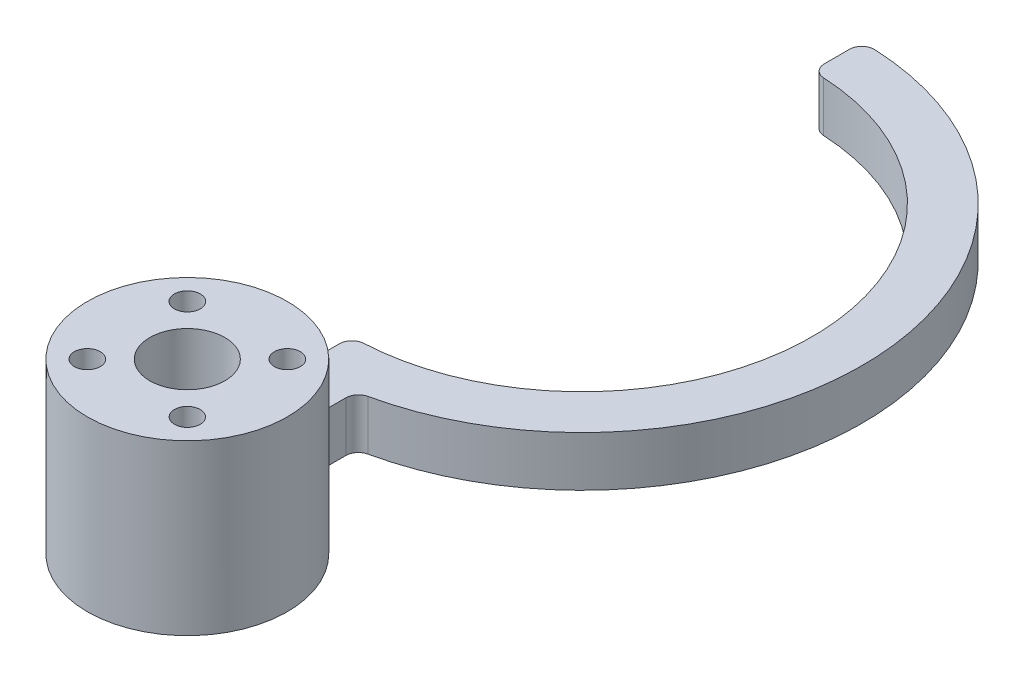
ISO-10303-21;
HEADER;
FILE_DESCRIPTION(('STEP AP214'),'2;1');
FILE_NAME('part.step','',(''),(''),'','','');
FILE_SCHEMA(('AUTOMOTIVE_DESIGN { 1 0 10303 214 1 1 1 1 }'));
ENDSEC;
DATA;
#1=APPLICATION_CONTEXT('core data for automotive mechanical design processes');
#2=APPLICATION_PROTOCOL_DEFINITION('international standard','automotive_design',2000,#1);
#3=PRODUCT_CONTEXT('',#1,'mechanical');
#4=PRODUCT('Part','Part','',(#3));
#5=PRODUCT_RELATED_PRODUCT_CATEGORY('part','',(#4));
#6=PRODUCT_DEFINITION_FORMATION('','',#4);
#7=PRODUCT_DEFINITION_CONTEXT('part definition',#1,'design');
#8=PRODUCT_DEFINITION('design','',#6,#7);
#9=PRODUCT_DEFINITION_SHAPE('','',#8);
#10=(LENGTH_UNIT() NAMED_UNIT(*) SI_UNIT(.MILLI.,.METRE.));
#11=(NAMED_UNIT(*) PLANE_ANGLE_UNIT() SI_UNIT($,.RADIAN.));
#12=(NAMED_UNIT(*) SI_UNIT($,.STERADIAN.) SOLID_ANGLE_UNIT());
#13=UNCERTAINTY_MEASURE_WITH_UNIT(LENGTH_MEASURE(1.E-05),#10,'distance_accuracy_value','');
#14=(GEOMETRIC_REPRESENTATION_CONTEXT(3) GLOBAL_UNCERTAINTY_ASSIGNED_CONTEXT((#13)) GLOBAL_UNIT_ASSIGNED_CONTEXT((#10,
#11,#12)) REPRESENTATION_CONTEXT('',''));
#15=CARTESIAN_POINT('',(0.,0.,0.));
#16=DIRECTION('',(0.,0.,1.));
#17=DIRECTION('',(1.,0.,0.));
#18=AXIS2_PLACEMENT_3D('',#15,#16,#17);
#19=CARTESIAN_POINT('',(8.96696536966746,8.,72.0811709693591));
#20=DIRECTION('',(0.,-1.,0.));
#21=DIRECTION('',(0.,0.,-1.));
#22=AXIS2_PLACEMENT_3D('',#19,#20,#21);
#23=CYLINDRICAL_SURFACE('',#22,16.);
#24=CARTESIAN_POINT('',(8.96696536966746,0.,72.0811709693591));
#25=DIRECTION('',(0.,1.,0.));
#26=DIRECTION('',(0.,0.,1.));
#27=AXIS2_PLACEMENT_3D('',#24,#25,#26);
#28=CIRCLE('',#27,16.);
#29=CARTESIAN_POINT('',(-0.781448292259167,0.,59.3938374797734));
#30=VERTEX_POINT('',#29);
#31=CARTESIAN_POINT('',(9.8852183744075,0.,56.1075423453023));
#32=VERTEX_POINT('',#31);
#33=EDGE_CURVE('E144',#30,#32,#28,.T.);
#34=ORIENTED_EDGE('',*,*,#33,.T.);
#35=DIRECTION('',(0.,-1.,0.));
#36=VECTOR('',#35,1.);
#37=CARTESIAN_POINT('',(9.8852183744075,8.,56.1075423453023));
#38=LINE('',#37,#36);
#39=CARTESIAN_POINT('',(9.8852183744075,8.,56.1075423453023));
#40=VERTEX_POINT('',#39);
#41=EDGE_CURVE('E128',#32,#40,#38,.F.);
#42=ORIENTED_EDGE('',*,*,#41,.T.);
#43=CARTESIAN_POINT('',(8.96696536966746,8.,72.0811709693591));
#44=DIRECTION('',(0.,1.,0.));
#45=DIRECTION('',(0.,0.,1.));
#46=AXIS2_PLACEMENT_3D('',#43,#44,#45);
#47=CIRCLE('',#46,16.);
#48=CARTESIAN_POINT('',(-0.781448292259167,8.,59.3938374797734));
#49=VERTEX_POINT('',#48);
#50=EDGE_CURVE('E142',#40,#49,#47,.T.);
#51=ORIENTED_EDGE('',*,*,#50,.T.);
#52=DIRECTION('',(0.,-1.,0.));
#53=VECTOR('',#52,1.);
#54=CARTESIAN_POINT('',(-0.781448292259167,8.,59.3938374797734));
#55=LINE('',#54,#53);
#56=EDGE_CURVE('E146',#49,#30,#55,.T.);
#57=ORIENTED_EDGE('',*,*,#56,.T.);
#58=EDGE_LOOP('',(#34,#42,#51,#57));
#59=FACE_BOUND('',#58,.T.);
#60=CARTESIAN_POINT('',(8.96696536966746,27.,72.0811709693591));
#61=DIRECTION('',(0.,1.,0.));
#62=DIRECTION('',(0.,0.,1.));
#63=AXIS2_PLACEMENT_3D('',#60,#61,#62);
#64=CIRCLE('',#63,16.);
#65=CARTESIAN_POINT('',(8.96696536966746,27.,88.0811709693591));
#66=VERTEX_POINT('',#65);
#67=EDGE_CURVE('E152',#66,#66,#64,.T.);
#68=ORIENTED_EDGE('',*,*,#67,.F.);
#69=EDGE_LOOP('',(#68));
#70=FACE_BOUND('',#69,.T.);
#71=ADVANCED_FACE('F35',(#59,#70),#23,.T.);
#72=CARTESIAN_POINT('',(8.00000000000002,8.,0.));
#73=DIRECTION('',(1.,0.,0.));
#74=DIRECTION('',(0.,0.,-1.));
#75=AXIS2_PLACEMENT_3D('',#72,#73,#74);
#76=PLANE('',#75);
#77=DIRECTION('',(0.,0.,1.));
#78=VECTOR('',#77,1.);
#79=CARTESIAN_POINT('',(8.00000000000002,8.,0.));
#80=LINE('',#79,#78);
#81=CARTESIAN_POINT('',(8.,8.,45.7498513658788));
#82=VERTEX_POINT('',#81);
#83=CARTESIAN_POINT('',(8.,8.,54.1108387672952));
#84=VERTEX_POINT('',#83);
#85=EDGE_CURVE('E165',#82,#84,#80,.T.);
#86=ORIENTED_EDGE('',*,*,#85,.T.);
#87=DIRECTION('',(0.,-1.,0.));
#88=VECTOR('',#87,1.);
#89=CARTESIAN_POINT('',(8.,8.,54.1108387672952));
#90=LINE('',#89,#88);
#91=CARTESIAN_POINT('',(8.,0.,54.1108387672952));
#92=VERTEX_POINT('',#91);
#93=EDGE_CURVE('E130',#84,#92,#90,.T.);
#94=ORIENTED_EDGE('',*,*,#93,.T.);
#95=DIRECTION('',(0.,0.,1.));
#96=VECTOR('',#95,1.);
#97=CARTESIAN_POINT('',(8.00000000000002,0.,0.));
#98=LINE('',#97,#96);
#99=CARTESIAN_POINT('',(8.,0.,45.7498513658788));
#100=VERTEX_POINT('',#99);
#101=EDGE_CURVE('E193',#100,#92,#98,.T.);
#102=ORIENTED_EDGE('',*,*,#101,.F.);
#103=DIRECTION('',(0.,-1.,0.));
#104=VECTOR('',#103,1.);
#105=CARTESIAN_POINT('',(8.,8.,45.7498513658788));
#106=LINE('',#105,#104);
#107=EDGE_CURVE('E177',#100,#82,#106,.F.);
#108=ORIENTED_EDGE('',*,*,#107,.T.);
#109=EDGE_LOOP('',(#86,#94,#102,#108));
#110=FACE_BOUND('',#109,.T.);
#111=ADVANCED_FACE('F267',(#110),#76,.T.);
#112=CARTESIAN_POINT('',(0.,8.,0.));
#113=DIRECTION('',(0.,-1.,0.));
#114=DIRECTION('',(0.,0.,-1.));
#115=AXIS2_PLACEMENT_3D('',#112,#113,#114);
#116=CYLINDRICAL_SURFACE('',#115,44.83);
#117=CARTESIAN_POINT('',(0.,8.,0.));
#118=DIRECTION('',(0.,1.,0.));
#119=DIRECTION('',(0.,0.,1.));
#120=AXIS2_PLACEMENT_3D('',#117,#118,#119);
#121=CIRCLE('',#120,44.83);
#122=CARTESIAN_POINT('',(9.57292333973949,8.,43.7959819930033));
#123=VERTEX_POINT('',#122);
#124=CARTESIAN_POINT('',(2.09339248190515,8.,-44.7810965466089));
#125=VERTEX_POINT('',#124);
#126=EDGE_CURVE('E167',#123,#125,#121,.T.);
#127=ORIENTED_EDGE('',*,*,#126,.F.);
#128=DIRECTION('',(0.,-1.,0.));
#129=VECTOR('',#128,1.);
#130=CARTESIAN_POINT('',(9.57292333973949,8.,43.7959819930033));
#131=LINE('',#130,#129);
#132=CARTESIAN_POINT('',(9.57292333973949,0.,43.7959819930033));
#133=VERTEX_POINT('',#132);
#134=EDGE_CURVE('E210',#123,#133,#131,.T.);
#135=ORIENTED_EDGE('',*,*,#134,.T.);
#136=CARTESIAN_POINT('',(0.,0.,0.));
#137=DIRECTION('',(0.,1.,0.));
#138=DIRECTION('',(0.,0.,1.));
#139=AXIS2_PLACEMENT_3D('',#136,#137,#138);
#140=CIRCLE('',#139,44.83);
#141=CARTESIAN_POINT('',(2.09339248190515,0.,-44.7810965466089));
#142=VERTEX_POINT('',#141);
#143=EDGE_CURVE('E196',#133,#142,#140,.T.);
#144=ORIENTED_EDGE('',*,*,#143,.T.);
#145=DIRECTION('',(0.,-1.,0.));
#146=VECTOR('',#145,1.);
#147=CARTESIAN_POINT('',(2.09339248190515,8.,-44.7810965466089));
#148=LINE('',#147,#146);
#149=EDGE_CURVE('E145',#142,#125,#148,.F.);
#150=ORIENTED_EDGE('',*,*,#149,.T.);
#151=EDGE_LOOP('',(#127,#135,#144,#150));
#152=FACE_BOUND('',#151,.T.);
#153=ADVANCED_FACE('F274',(#152),#116,.T.);
#154=CARTESIAN_POINT('',(0.,8.,0.));
#155=DIRECTION('',(1.,0.,0.));
#156=DIRECTION('',(0.,0.,-1.));
#157=AXIS2_PLACEMENT_3D('',#154,#155,#156);
#158=PLANE('',#157);
#159=DIRECTION('',(0.,0.,1.));
#160=VECTOR('',#159,1.);
#161=CARTESIAN_POINT('',(0.,0.,0.));
#162=LINE('',#161,#160);
#163=CARTESIAN_POINT('',(0.,0.,-42.7832782755132));
#164=VERTEX_POINT('',#163);
#165=CARTESIAN_POINT('',(0.,0.,-38.7784592267408));
#166=VERTEX_POINT('',#165);
#167=EDGE_CURVE('E199',#164,#166,#162,.T.);
#168=ORIENTED_EDGE('',*,*,#167,.T.);
#169=DIRECTION('',(0.,1.,0.));
#170=VECTOR('',#169,1.);
#171=CARTESIAN_POINT('',(0.,8.,-38.7784592267408));
#172=LINE('',#171,#170);
#173=CARTESIAN_POINT('',(0.,8.,-38.7784592267408));
#174=VERTEX_POINT('',#173);
#175=EDGE_CURVE('E50',#166,#174,#172,.T.);
#176=ORIENTED_EDGE('',*,*,#175,.T.);
#177=DIRECTION('',(0.,0.,1.));
#178=VECTOR('',#177,1.);
#179=CARTESIAN_POINT('',(0.,8.,0.));
#180=LINE('',#179,#178);
#181=CARTESIAN_POINT('',(0.,8.,-42.7832782755132));
#182=VERTEX_POINT('',#181);
#183=EDGE_CURVE('E170',#182,#174,#180,.T.);
#184=ORIENTED_EDGE('',*,*,#183,.F.);
#185=DIRECTION('',(0.,-1.,0.));
#186=VECTOR('',#185,1.);
#187=CARTESIAN_POINT('',(0.,8.,-42.7832782755132));
#188=LINE('',#187,#186);
#189=EDGE_CURVE('E234',#182,#164,#188,.T.);
#190=ORIENTED_EDGE('',*,*,#189,.T.);
#191=EDGE_LOOP('',(#168,#176,#184,#190));
#192=FACE_BOUND('',#191,.T.);
#193=ADVANCED_FACE('F316',(#192),#158,.F.);
#194=CARTESIAN_POINT('',(0.,8.,0.));
#195=DIRECTION('',(0.,-1.,0.));
#196=DIRECTION('',(0.,0.,-1.));
#197=AXIS2_PLACEMENT_3D('',#194,#195,#196);
#198=CYLINDRICAL_SURFACE('',#197,36.83);
#199=CARTESIAN_POINT('',(0.,0.,0.));
#200=DIRECTION('',(0.,1.,0.));
#201=DIRECTION('',(0.,0.,1.));
#202=AXIS2_PLACEMENT_3D('',#199,#200,#201);
#203=CIRCLE('',#202,36.83);
#204=CARTESIAN_POINT('',(1.8969868658254,0.,36.7811139150364));
#205=VERTEX_POINT('',#204);
#206=CARTESIAN_POINT('',(1.89698686582535,0.,-36.7811139150364));
#207=VERTEX_POINT('',#206);
#208=EDGE_CURVE('E201',#205,#207,#203,.T.);
#209=ORIENTED_EDGE('',*,*,#208,.F.);
#210=DIRECTION('',(0.,-1.,0.));
#211=VECTOR('',#210,1.);
#212=CARTESIAN_POINT('',(1.8969868658254,8.,36.7811139150364));
#213=LINE('',#212,#211);
#214=CARTESIAN_POINT('',(1.8969868658254,8.,36.7811139150364));
#215=VERTEX_POINT('',#214);
#216=EDGE_CURVE('E227',#205,#215,#213,.F.);
#217=ORIENTED_EDGE('',*,*,#216,.T.);
#218=CARTESIAN_POINT('',(0.,8.,0.));
#219=DIRECTION('',(0.,1.,0.));
#220=DIRECTION('',(0.,0.,1.));
#221=AXIS2_PLACEMENT_3D('',#218,#219,#220);
#222=CIRCLE('',#221,36.83);
#223=CARTESIAN_POINT('',(1.89698686582535,8.,-36.7811139150364));
#224=VERTEX_POINT('',#223);
#225=EDGE_CURVE('E172',#215,#224,#222,.T.);
#226=ORIENTED_EDGE('',*,*,#225,.T.);
#227=DIRECTION('',(0.,-1.,0.));
#228=VECTOR('',#227,1.);
#229=CARTESIAN_POINT('',(1.89698686582535,8.,-36.7811139150364));
#230=LINE('',#229,#228);
#231=EDGE_CURVE('E224',#224,#207,#230,.T.);
#232=ORIENTED_EDGE('',*,*,#231,.T.);
#233=EDGE_LOOP('',(#209,#217,#226,#232));
#234=FACE_BOUND('',#233,.T.);
#235=ADVANCED_FACE('F282',(#234),#198,.F.);
#236=CARTESIAN_POINT('',(0.966965369667458,8.,80.0811709693591));
#237=DIRECTION('',(0.,-1.,0.));
#238=DIRECTION('',(0.,0.,-1.));
#239=AXIS2_PLACEMENT_3D('',#236,#237,#238);
#240=CYLINDRICAL_SURFACE('',#239,2.07500000000001);
#241=CARTESIAN_POINT('',(0.966965369667458,0.,80.0811709693591));
#242=DIRECTION('',(0.,1.,0.));
#243=DIRECTION('',(0.,0.,1.));
#244=AXIS2_PLACEMENT_3D('',#241,#242,#243);
#245=CIRCLE('',#244,2.07500000000001);
#246=CARTESIAN_POINT('',(0.966965369667458,0.,82.1561709693591));
#247=VERTEX_POINT('',#246);
#248=EDGE_CURVE('E189',#247,#247,#245,.T.);
#249=ORIENTED_EDGE('',*,*,#248,.F.);
#250=EDGE_LOOP('',(#249));
#251=FACE_BOUND('',#250,.T.);
#252=CARTESIAN_POINT('',(0.966965369667458,27.,80.0811709693591));
#253=DIRECTION('',(0.,1.,0.));
#254=DIRECTION('',(0.,0.,1.));
#255=AXIS2_PLACEMENT_3D('',#252,#253,#254);
#256=CIRCLE('',#255,2.07500000000001);
#257=CARTESIAN_POINT('',(0.966965369667458,27.,82.1561709693591));
#258=VERTEX_POINT('',#257);
#259=EDGE_CURVE('E368',#258,#258,#256,.T.);
#260=ORIENTED_EDGE('',*,*,#259,.T.);
#261=EDGE_LOOP('',(#260));
#262=FACE_BOUND('',#261,.T.);
#263=ADVANCED_FACE('F279',(#251,#262),#240,.F.);
#264=CARTESIAN_POINT('',(16.9669653696675,8.,80.0811709693591));
#265=DIRECTION('',(0.,-1.,0.));
#266=DIRECTION('',(0.,0.,-1.));
#267=AXIS2_PLACEMENT_3D('',#264,#265,#266);
#268=CYLINDRICAL_SURFACE('',#267,2.07500000000001);
#269=CARTESIAN_POINT('',(16.9669653696675,8.,80.0811709693591));
#270=DIRECTION('',(0.,1.,0.));
#271=DIRECTION('',(0.,0.,1.));
#272=AXIS2_PLACEMENT_3D('',#269,#270,#271);
#273=CIRCLE('',#272,2.07500000000001);
#274=CARTESIAN_POINT('',(16.9669653696675,8.,82.1561709693591));
#275=VERTEX_POINT('',#274);
#276=EDGE_CURVE('E156',#275,#275,#273,.T.);
#277=ORIENTED_EDGE('',*,*,#276,.T.);
#278=EDGE_LOOP('',(#277));
#279=FACE_BOUND('',#278,.T.);
#280=CARTESIAN_POINT('',(16.9669653696675,0.,80.0811709693591));
#281=DIRECTION('',(0.,1.,0.));
#282=DIRECTION('',(0.,0.,1.));
#283=AXIS2_PLACEMENT_3D('',#280,#281,#282);
#284=CIRCLE('',#283,2.07500000000001);
#285=CARTESIAN_POINT('',(16.9669653696675,0.,82.1561709693591));
#286=VERTEX_POINT('',#285);
#287=EDGE_CURVE('E186',#286,#286,#284,.T.);
#288=ORIENTED_EDGE('',*,*,#287,.F.);
#289=EDGE_LOOP('',(#288));
#290=FACE_BOUND('',#289,.T.);
#291=ADVANCED_FACE('F281',(#279,#290),#268,.F.);
#292=CARTESIAN_POINT('',(16.9669653696675,8.,64.0811709693591));
#293=DIRECTION('',(0.,-1.,0.));
#294=DIRECTION('',(0.,0.,-1.));
#295=AXIS2_PLACEMENT_3D('',#292,#293,#294);
#296=CYLINDRICAL_SURFACE('',#295,2.075);
#297=CARTESIAN_POINT('',(16.9669653696675,0.,64.0811709693591));
#298=DIRECTION('',(0.,1.,0.));
#299=DIRECTION('',(0.,0.,1.));
#300=AXIS2_PLACEMENT_3D('',#297,#298,#299);
#301=CIRCLE('',#300,2.075);
#302=CARTESIAN_POINT('',(16.9669653696675,0.,66.1561709693591));
#303=VERTEX_POINT('',#302);
#304=EDGE_CURVE('E183',#303,#303,#301,.T.);
#305=ORIENTED_EDGE('',*,*,#304,.F.);
#306=EDGE_LOOP('',(#305));
#307=FACE_BOUND('',#306,.T.);
#308=CARTESIAN_POINT('',(16.9669653696675,27.,64.0811709693591));
#309=DIRECTION('',(0.,1.,0.));
#310=DIRECTION('',(0.,0.,1.));
#311=AXIS2_PLACEMENT_3D('',#308,#309,#310);
#312=CIRCLE('',#311,2.07499999999999);
#313=CARTESIAN_POINT('',(16.9669653696675,27.,66.1561709693591));
#314=VERTEX_POINT('',#313);
#315=EDGE_CURVE('E370',#314,#314,#312,.T.);
#316=ORIENTED_EDGE('',*,*,#315,.T.);
#317=EDGE_LOOP('',(#316));
#318=FACE_BOUND('',#317,.T.);
#319=ADVANCED_FACE('F286',(#307,#318),#296,.F.);
#320=CARTESIAN_POINT('',(0.966965369667458,8.,64.0811709693591));
#321=DIRECTION('',(0.,-1.,0.));
#322=DIRECTION('',(0.,0.,-1.));
#323=AXIS2_PLACEMENT_3D('',#320,#321,#322);
#324=CYLINDRICAL_SURFACE('',#323,2.07500000000001);
#325=CARTESIAN_POINT('',(0.966965369667458,0.,64.0811709693591));
#326=DIRECTION('',(0.,1.,0.));
#327=DIRECTION('',(0.,0.,1.));
#328=AXIS2_PLACEMENT_3D('',#325,#326,#327);
#329=CIRCLE('',#328,2.07500000000001);
#330=CARTESIAN_POINT('',(0.966965369667458,0.,66.1561709693591));
#331=VERTEX_POINT('',#330);
#332=EDGE_CURVE('E180',#331,#331,#329,.T.);
#333=ORIENTED_EDGE('',*,*,#332,.F.);
#334=EDGE_LOOP('',(#333));
#335=FACE_BOUND('',#334,.T.);
#336=CARTESIAN_POINT('',(0.966965369667458,27.,64.0811709693591));
#337=DIRECTION('',(0.,1.,0.));
#338=DIRECTION('',(0.,0.,1.));
#339=AXIS2_PLACEMENT_3D('',#336,#337,#338);
#340=CIRCLE('',#339,2.075);
#341=CARTESIAN_POINT('',(0.966965369667458,27.,66.1561709693591));
#342=VERTEX_POINT('',#341);
#343=EDGE_CURVE('E153',#342,#342,#340,.T.);
#344=ORIENTED_EDGE('',*,*,#343,.T.);
#345=EDGE_LOOP('',(#344));
#346=FACE_BOUND('',#345,.T.);
#347=ADVANCED_FACE('F290',(#335,#346),#324,.F.);
#348=CARTESIAN_POINT('',(8.96696536966746,8.,72.0811709693591));
#349=DIRECTION('',(0.,-1.,0.));
#350=DIRECTION('',(0.,0.,-1.));
#351=AXIS2_PLACEMENT_3D('',#348,#349,#350);
#352=CYLINDRICAL_SURFACE('',#351,6.00320826308857);
#353=CARTESIAN_POINT('',(8.96696536966746,0.,72.0811709693591));
#354=DIRECTION('',(0.,1.,0.));
#355=DIRECTION('',(0.,0.,1.));
#356=AXIS2_PLACEMENT_3D('',#353,#354,#355);
#357=CIRCLE('',#356,6.00320826308857);
#358=CARTESIAN_POINT('',(8.96696536966746,0.,78.0843792324477));
#359=VERTEX_POINT('',#358);
#360=EDGE_CURVE('E164',#359,#359,#357,.T.);
#361=ORIENTED_EDGE('',*,*,#360,.F.);
#362=EDGE_LOOP('',(#361));
#363=FACE_BOUND('',#362,.T.);
#364=CARTESIAN_POINT('',(8.96696536966746,27.,72.0811709693591));
#365=DIRECTION('',(0.,1.,0.));
#366=DIRECTION('',(0.,0.,1.));
#367=AXIS2_PLACEMENT_3D('',#364,#365,#366);
#368=CIRCLE('',#367,6.00320826308856);
#369=CARTESIAN_POINT('',(8.96696536966746,27.,78.0843792324477));
#370=VERTEX_POINT('',#369);
#371=EDGE_CURVE('E159',#370,#370,#368,.T.);
#372=ORIENTED_EDGE('',*,*,#371,.T.);
#373=EDGE_LOOP('',(#372));
#374=FACE_BOUND('',#373,.T.);
#375=ADVANCED_FACE('F294',(#363,#374),#352,.F.);
#376=CARTESIAN_POINT('',(0.,8.,0.));
#377=DIRECTION('',(1.,0.,0.));
#378=DIRECTION('',(0.,0.,-1.));
#379=AXIS2_PLACEMENT_3D('',#376,#377,#378);
#380=PLANE('',#379);
#381=DIRECTION('',(0.,0.,1.));
#382=VECTOR('',#381,1.);
#383=CARTESIAN_POINT('',(0.,0.,0.));
#384=LINE('',#383,#382);
#385=CARTESIAN_POINT('',(0.,0.,38.7784592267408));
#386=VERTEX_POINT('',#385);
#387=CARTESIAN_POINT('',(0.,0.,57.8079207935752));
#388=VERTEX_POINT('',#387);
#389=EDGE_CURVE('E168',#386,#388,#384,.T.);
#390=ORIENTED_EDGE('',*,*,#389,.T.);
#391=DIRECTION('',(0.,1.,0.));
#392=VECTOR('',#391,1.);
#393=CARTESIAN_POINT('',(0.,8.,57.8079207935752));
#394=LINE('',#393,#392);
#395=CARTESIAN_POINT('',(0.,8.,57.8079207935752));
#396=VERTEX_POINT('',#395);
#397=EDGE_CURVE('E216',#388,#396,#394,.T.);
#398=ORIENTED_EDGE('',*,*,#397,.T.);
#399=DIRECTION('',(0.,0.,1.));
#400=VECTOR('',#399,1.);
#401=CARTESIAN_POINT('',(0.,8.,0.));
#402=LINE('',#401,#400);
#403=CARTESIAN_POINT('',(0.,8.,38.7784592267408));
#404=VERTEX_POINT('',#403);
#405=EDGE_CURVE('E175',#404,#396,#402,.T.);
#406=ORIENTED_EDGE('',*,*,#405,.F.);
#407=DIRECTION('',(0.,1.,0.));
#408=VECTOR('',#407,1.);
#409=CARTESIAN_POINT('',(0.,0.,38.7784592267408));
#410=LINE('',#409,#408);
#411=EDGE_CURVE('E213',#404,#386,#410,.F.);
#412=ORIENTED_EDGE('',*,*,#411,.T.);
#413=EDGE_LOOP('',(#390,#398,#406,#412));
#414=FACE_BOUND('',#413,.T.);
#415=ADVANCED_FACE('F247',(#414),#380,.F.);
#416=CARTESIAN_POINT('',(0.,8.,0.));
#417=DIRECTION('',(0.,1.,0.));
#418=DIRECTION('',(0.,0.,1.));
#419=AXIS2_PLACEMENT_3D('',#416,#417,#418);
#420=PLANE('',#419);
#421=ORIENTED_EDGE('',*,*,#50,.F.);
#422=CARTESIAN_POINT('',(10.,8.,54.1108387672952));
#423=DIRECTION('',(0.,1.,0.));
#424=DIRECTION('',(0.,0.,1.));
#425=AXIS2_PLACEMENT_3D('',#422,#423,#424);
#426=CIRCLE('',#425,2.);
#427=EDGE_CURVE('E125',#40,#84,#426,.F.);
#428=ORIENTED_EDGE('',*,*,#427,.T.);
#429=ORIENTED_EDGE('',*,*,#85,.F.);
#430=CARTESIAN_POINT('',(10.,8.,45.7498513658788));
#431=DIRECTION('',(0.,1.,0.));
#432=DIRECTION('',(0.,0.,1.));
#433=AXIS2_PLACEMENT_3D('',#430,#431,#432);
#434=CIRCLE('',#433,2.);
#435=EDGE_CURVE('E240',#82,#123,#434,.F.);
#436=ORIENTED_EDGE('',*,*,#435,.T.);
#437=ORIENTED_EDGE('',*,*,#126,.T.);
#438=CARTESIAN_POINT('',(1.99999999999995,8.,-42.7832782755132));
#439=DIRECTION('',(0.,1.,0.));
#440=DIRECTION('',(0.,0.,1.));
#441=AXIS2_PLACEMENT_3D('',#438,#439,#440);
#442=CIRCLE('',#441,2.);
#443=EDGE_CURVE('E57',#125,#182,#442,.T.);
#444=ORIENTED_EDGE('',*,*,#443,.T.);
#445=ORIENTED_EDGE('',*,*,#183,.T.);
#446=CARTESIAN_POINT('',(1.99999999999995,8.,-38.7784592267408));
#447=DIRECTION('',(0.,1.,0.));
#448=DIRECTION('',(0.,0.,1.));
#449=AXIS2_PLACEMENT_3D('',#446,#447,#448);
#450=CIRCLE('',#449,2.);
#451=EDGE_CURVE('E230',#174,#224,#450,.T.);
#452=ORIENTED_EDGE('',*,*,#451,.T.);
#453=ORIENTED_EDGE('',*,*,#225,.F.);
#454=CARTESIAN_POINT('',(2.,8.,38.7784592267408));
#455=DIRECTION('',(0.,1.,0.));
#456=DIRECTION('',(0.,0.,1.));
#457=AXIS2_PLACEMENT_3D('',#454,#455,#456);
#458=CIRCLE('',#457,2.);
#459=EDGE_CURVE('E232',#215,#404,#458,.T.);
#460=ORIENTED_EDGE('',*,*,#459,.T.);
#461=ORIENTED_EDGE('',*,*,#405,.T.);
#462=CARTESIAN_POINT('',(-1.99999999999999,8.,57.8079207935752));
#463=DIRECTION('',(0.,1.,0.));
#464=DIRECTION('',(0.,0.,1.));
#465=AXIS2_PLACEMENT_3D('',#462,#463,#464);
#466=CIRCLE('',#465,2.);
#467=EDGE_CURVE('E11',#396,#49,#466,.F.);
#468=ORIENTED_EDGE('',*,*,#467,.T.);
#469=EDGE_LOOP('',(#421,#428,#429,#436,#437,#444,#445,#452,#453,#460,#461,#468));
#470=FACE_BOUND('',#469,.T.);
#471=ADVANCED_FACE('F148',(#470),#420,.T.);
#472=CARTESIAN_POINT('',(0.,0.,0.));
#473=DIRECTION('',(0.,1.,0.));
#474=DIRECTION('',(0.,0.,1.));
#475=AXIS2_PLACEMENT_3D('',#472,#473,#474);
#476=PLANE('',#475);
#477=ORIENTED_EDGE('',*,*,#360,.T.);
#478=EDGE_LOOP('',(#477));
#479=FACE_BOUND('',#478,.T.);
#480=ORIENTED_EDGE('',*,*,#332,.T.);
#481=EDGE_LOOP('',(#480));
#482=FACE_BOUND('',#481,.T.);
#483=ORIENTED_EDGE('',*,*,#304,.T.);
#484=EDGE_LOOP('',(#483));
#485=FACE_BOUND('',#484,.T.);
#486=ORIENTED_EDGE('',*,*,#287,.T.);
#487=EDGE_LOOP('',(#486));
#488=FACE_BOUND('',#487,.T.);
#489=ORIENTED_EDGE('',*,*,#248,.T.);
#490=EDGE_LOOP('',(#489));
#491=FACE_BOUND('',#490,.T.);
#492=ORIENTED_EDGE('',*,*,#389,.F.);
#493=CARTESIAN_POINT('',(2.,0.,38.7784592267408));
#494=DIRECTION('',(0.,1.,0.));
#495=DIRECTION('',(0.,0.,1.));
#496=AXIS2_PLACEMENT_3D('',#493,#494,#495);
#497=CIRCLE('',#496,2.);
#498=EDGE_CURVE('E222',#386,#205,#497,.F.);
#499=ORIENTED_EDGE('',*,*,#498,.T.);
#500=ORIENTED_EDGE('',*,*,#208,.T.);
#501=CARTESIAN_POINT('',(1.99999999999995,0.,-38.7784592267408));
#502=DIRECTION('',(0.,1.,0.));
#503=DIRECTION('',(0.,0.,1.));
#504=AXIS2_PLACEMENT_3D('',#501,#502,#503);
#505=CIRCLE('',#504,2.);
#506=EDGE_CURVE('E220',#207,#166,#505,.F.);
#507=ORIENTED_EDGE('',*,*,#506,.T.);
#508=ORIENTED_EDGE('',*,*,#167,.F.);
#509=CARTESIAN_POINT('',(1.99999999999995,0.,-42.7832782755132));
#510=DIRECTION('',(0.,1.,0.));
#511=DIRECTION('',(0.,0.,1.));
#512=AXIS2_PLACEMENT_3D('',#509,#510,#511);
#513=CIRCLE('',#512,2.);
#514=EDGE_CURVE('E218',#164,#142,#513,.F.);
#515=ORIENTED_EDGE('',*,*,#514,.T.);
#516=ORIENTED_EDGE('',*,*,#143,.F.);
#517=CARTESIAN_POINT('',(10.,0.,45.7498513658788));
#518=DIRECTION('',(0.,1.,0.));
#519=DIRECTION('',(0.,0.,1.));
#520=AXIS2_PLACEMENT_3D('',#517,#518,#519);
#521=CIRCLE('',#520,2.);
#522=EDGE_CURVE('E134',#133,#100,#521,.T.);
#523=ORIENTED_EDGE('',*,*,#522,.T.);
#524=ORIENTED_EDGE('',*,*,#101,.T.);
#525=CARTESIAN_POINT('',(10.,0.,54.1108387672952));
#526=DIRECTION('',(0.,1.,0.));
#527=DIRECTION('',(0.,0.,1.));
#528=AXIS2_PLACEMENT_3D('',#525,#526,#527);
#529=CIRCLE('',#528,2.);
#530=EDGE_CURVE('E135',#92,#32,#529,.T.);
#531=ORIENTED_EDGE('',*,*,#530,.T.);
#532=ORIENTED_EDGE('',*,*,#33,.F.);
#533=CARTESIAN_POINT('',(-1.99999999999999,0.,57.8079207935752));
#534=DIRECTION('',(0.,1.,0.));
#535=DIRECTION('',(0.,0.,1.));
#536=AXIS2_PLACEMENT_3D('',#533,#534,#535);
#537=CIRCLE('',#536,2.);
#538=EDGE_CURVE('E43',#30,#388,#537,.T.);
#539=ORIENTED_EDGE('',*,*,#538,.T.);
#540=EDGE_LOOP('',(#492,#499,#500,#507,#508,#515,#516,#523,#524,#531,#532,#539));
#541=FACE_BOUND('',#540,.T.);
#542=ADVANCED_FACE('F243',(#479,#482,#485,#488,#491,#541),#476,.F.);
#543=CARTESIAN_POINT('',(10.,8.,54.1108387672952));
#544=DIRECTION('',(0.,-1.,0.));
#545=DIRECTION('',(0.,0.,-1.));
#546=AXIS2_PLACEMENT_3D('',#543,#544,#545);
#547=CYLINDRICAL_SURFACE('',#546,2.);
#548=ORIENTED_EDGE('',*,*,#427,.F.);
#549=ORIENTED_EDGE('',*,*,#41,.F.);
#550=ORIENTED_EDGE('',*,*,#530,.F.);
#551=ORIENTED_EDGE('',*,*,#93,.F.);
#552=EDGE_LOOP('',(#548,#549,#550,#551));
#553=FACE_BOUND('',#552,.T.);
#554=ADVANCED_FACE('F127',(#553),#547,.F.);
#555=CARTESIAN_POINT('',(10.,8.,45.7498513658788));
#556=DIRECTION('',(0.,-1.,0.));
#557=DIRECTION('',(0.,0.,-1.));
#558=AXIS2_PLACEMENT_3D('',#555,#556,#557);
#559=CYLINDRICAL_SURFACE('',#558,2.);
#560=ORIENTED_EDGE('',*,*,#435,.F.);
#561=ORIENTED_EDGE('',*,*,#107,.F.);
#562=ORIENTED_EDGE('',*,*,#522,.F.);
#563=ORIENTED_EDGE('',*,*,#134,.F.);
#564=EDGE_LOOP('',(#560,#561,#562,#563));
#565=FACE_BOUND('',#564,.T.);
#566=ADVANCED_FACE('F253',(#565),#559,.F.);
#567=CARTESIAN_POINT('',(-1.99999999999999,8.,57.8079207935752));
#568=DIRECTION('',(0.,-1.,0.));
#569=DIRECTION('',(0.,0.,-1.));
#570=AXIS2_PLACEMENT_3D('',#567,#568,#569);
#571=CYLINDRICAL_SURFACE('',#570,2.);
#572=ORIENTED_EDGE('',*,*,#467,.F.);
#573=ORIENTED_EDGE('',*,*,#397,.F.);
#574=ORIENTED_EDGE('',*,*,#538,.F.);
#575=ORIENTED_EDGE('',*,*,#56,.F.);
#576=EDGE_LOOP('',(#572,#573,#574,#575));
#577=FACE_BOUND('',#576,.T.);
#578=ADVANCED_FACE('F250',(#577),#571,.F.);
#579=CARTESIAN_POINT('',(2.,8.,38.7784592267408));
#580=DIRECTION('',(0.,-1.,0.));
#581=DIRECTION('',(0.,0.,-1.));
#582=AXIS2_PLACEMENT_3D('',#579,#580,#581);
#583=CYLINDRICAL_SURFACE('',#582,2.);
#584=ORIENTED_EDGE('',*,*,#459,.F.);
#585=ORIENTED_EDGE('',*,*,#216,.F.);
#586=ORIENTED_EDGE('',*,*,#498,.F.);
#587=ORIENTED_EDGE('',*,*,#411,.F.);
#588=EDGE_LOOP('',(#584,#585,#586,#587));
#589=FACE_BOUND('',#588,.T.);
#590=ADVANCED_FACE('F252',(#589),#583,.T.);
#591=CARTESIAN_POINT('',(1.99999999999995,8.,-38.7784592267408));
#592=DIRECTION('',(0.,-1.,0.));
#593=DIRECTION('',(0.,0.,-1.));
#594=AXIS2_PLACEMENT_3D('',#591,#592,#593);
#595=CYLINDRICAL_SURFACE('',#594,2.);
#596=ORIENTED_EDGE('',*,*,#451,.F.);
#597=ORIENTED_EDGE('',*,*,#175,.F.);
#598=ORIENTED_EDGE('',*,*,#506,.F.);
#599=ORIENTED_EDGE('',*,*,#231,.F.);
#600=EDGE_LOOP('',(#596,#597,#598,#599));
#601=FACE_BOUND('',#600,.T.);
#602=ADVANCED_FACE('F260',(#601),#595,.T.);
#603=CARTESIAN_POINT('',(1.99999999999995,8.,-42.7832782755132));
#604=DIRECTION('',(0.,-1.,0.));
#605=DIRECTION('',(0.,0.,-1.));
#606=AXIS2_PLACEMENT_3D('',#603,#604,#605);
#607=CYLINDRICAL_SURFACE('',#606,2.);
#608=ORIENTED_EDGE('',*,*,#443,.F.);
#609=ORIENTED_EDGE('',*,*,#149,.F.);
#610=ORIENTED_EDGE('',*,*,#514,.F.);
#611=ORIENTED_EDGE('',*,*,#189,.F.);
#612=EDGE_LOOP('',(#608,#609,#610,#611));
#613=FACE_BOUND('',#612,.T.);
#614=ADVANCED_FACE('F37',(#613),#607,.T.);
#615=CARTESIAN_POINT('',(8.96696536966746,27.,72.0811709693591));
#616=DIRECTION('',(0.,1.,0.));
#617=DIRECTION('',(0.,0.,1.));
#618=AXIS2_PLACEMENT_3D('',#615,#616,#617);
#619=PLANE('',#618);
#620=CARTESIAN_POINT('',(16.9669653696675,27.,80.0811709693591));
#621=DIRECTION('',(0.,1.,0.));
#622=DIRECTION('',(0.,0.,1.));
#623=AXIS2_PLACEMENT_3D('',#620,#621,#622);
#624=CIRCLE('',#623,2.05906738444366);
#625=CARTESIAN_POINT('',(16.9669653696675,27.,82.1402383538028));
#626=VERTEX_POINT('',#625);
#627=EDGE_CURVE('E363',#626,#626,#624,.T.);
#628=ORIENTED_EDGE('',*,*,#627,.F.);
#629=EDGE_LOOP('',(#628));
#630=FACE_BOUND('',#629,.T.);
#631=ORIENTED_EDGE('',*,*,#371,.F.);
#632=EDGE_LOOP('',(#631));
#633=FACE_BOUND('',#632,.T.);
#634=ORIENTED_EDGE('',*,*,#67,.T.);
#635=EDGE_LOOP('',(#634));
#636=FACE_BOUND('',#635,.T.);
#637=ORIENTED_EDGE('',*,*,#343,.F.);
#638=EDGE_LOOP('',(#637));
#639=FACE_BOUND('',#638,.T.);
#640=ORIENTED_EDGE('',*,*,#315,.F.);
#641=EDGE_LOOP('',(#640));
#642=FACE_BOUND('',#641,.T.);
#643=ORIENTED_EDGE('',*,*,#259,.F.);
#644=EDGE_LOOP('',(#643));
#645=FACE_BOUND('',#644,.T.);
#646=ADVANCED_FACE('F343',(#630,#633,#636,#639,#642,#645),#619,.T.);
#647=CARTESIAN_POINT('',(8.96696536966746,8.,72.0811709693591));
#648=DIRECTION('',(0.,1.,0.));
#649=DIRECTION('',(0.,0.,1.));
#650=AXIS2_PLACEMENT_3D('',#647,#648,#649);
#651=PLANE('',#650);
#652=ORIENTED_EDGE('',*,*,#276,.F.);
#653=EDGE_LOOP('',(#652));
#654=FACE_BOUND('',#653,.T.);
#655=CARTESIAN_POINT('',(16.9669653696675,8.,80.0811709693591));
#656=DIRECTION('',(0.,1.,0.));
#657=DIRECTION('',(0.,0.,1.));
#658=AXIS2_PLACEMENT_3D('',#655,#656,#657);
#659=CIRCLE('',#658,2.05906738444366);
#660=CARTESIAN_POINT('',(16.9669653696675,8.,82.1402383538028));
#661=VERTEX_POINT('',#660);
#662=EDGE_CURVE('E366',#661,#661,#659,.T.);
#663=ORIENTED_EDGE('',*,*,#662,.T.);
#664=EDGE_LOOP('',(#663));
#665=FACE_BOUND('',#664,.T.);
#666=ADVANCED_FACE('F347',(#654,#665),#651,.F.);
#667=CARTESIAN_POINT('',(16.9669653696675,27.,80.0811709693591));
#668=DIRECTION('',(0.,-1.,0.));
#669=DIRECTION('',(0.,0.,-1.));
#670=AXIS2_PLACEMENT_3D('',#667,#668,#669);
#671=CYLINDRICAL_SURFACE('',#670,2.05906738444366);
#672=ORIENTED_EDGE('',*,*,#627,.T.);
#673=EDGE_LOOP('',(#672));
#674=FACE_BOUND('',#673,.T.);
#675=ORIENTED_EDGE('',*,*,#662,.F.);
#676=EDGE_LOOP('',(#675));
#677=FACE_BOUND('',#676,.T.);
#678=ADVANCED_FACE('F352',(#674,#677),#671,.F.);
#679=CLOSED_SHELL('',(#71,#111,#153,#193,#235,#263,#291,#319,#347,#375,#415,#471,#542,#554,#566,
#578,#590,#602,#614,#646,#666,#678));
#680=MANIFOLD_SOLID_BREP('B2',#679);
#681=ADVANCED_BREP_SHAPE_REPRESENTATION('',(#18,#680),#14);
#682=SHAPE_DEFINITION_REPRESENTATION(#9,#681);
ENDSEC;
END-ISO-10303-21;
